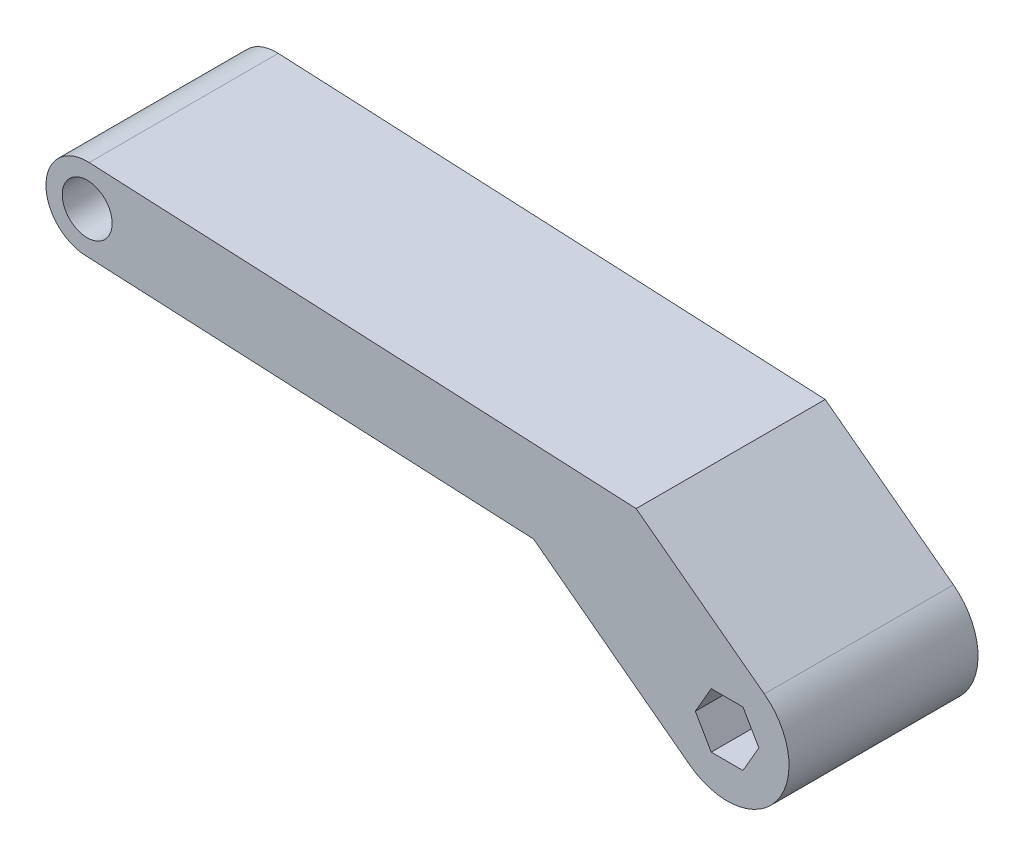
ISO-10303-21;
HEADER;
FILE_DESCRIPTION(('STEP AP214'),'2;1');
FILE_NAME('part.step','',(''),(''),'','','');
FILE_SCHEMA(('AUTOMOTIVE_DESIGN { 1 0 10303 214 1 1 1 1 }'));
ENDSEC;
DATA;
#1=APPLICATION_CONTEXT('core data for automotive mechanical design processes');
#2=APPLICATION_PROTOCOL_DEFINITION('international standard','automotive_design',2000,#1);
#3=PRODUCT_CONTEXT('',#1,'mechanical');
#4=PRODUCT('Part','Part','',(#3));
#5=PRODUCT_RELATED_PRODUCT_CATEGORY('part','',(#4));
#6=PRODUCT_DEFINITION_FORMATION('','',#4);
#7=PRODUCT_DEFINITION_CONTEXT('part definition',#1,'design');
#8=PRODUCT_DEFINITION('design','',#6,#7);
#9=PRODUCT_DEFINITION_SHAPE('','',#8);
#10=(LENGTH_UNIT() NAMED_UNIT(*) SI_UNIT(.MILLI.,.METRE.));
#11=(NAMED_UNIT(*) PLANE_ANGLE_UNIT() SI_UNIT($,.RADIAN.));
#12=(NAMED_UNIT(*) SI_UNIT($,.STERADIAN.) SOLID_ANGLE_UNIT());
#13=UNCERTAINTY_MEASURE_WITH_UNIT(LENGTH_MEASURE(1.E-05),#10,'distance_accuracy_value','');
#14=(GEOMETRIC_REPRESENTATION_CONTEXT(3) GLOBAL_UNCERTAINTY_ASSIGNED_CONTEXT((#13)) GLOBAL_UNIT_ASSIGNED_CONTEXT((#10,
#11,#12)) REPRESENTATION_CONTEXT('',''));
#15=CARTESIAN_POINT('',(0.,0.,0.));
#16=DIRECTION('',(0.,0.,1.));
#17=DIRECTION('',(1.,0.,0.));
#18=AXIS2_PLACEMENT_3D('',#15,#16,#17);
#19=CARTESIAN_POINT('',(0.,0.,27.5));
#20=DIRECTION('',(0.,0.,1.));
#21=DIRECTION('',(1.,0.,0.));
#22=AXIS2_PLACEMENT_3D('',#19,#20,#21);
#23=PLANE('',#22);
#24=CARTESIAN_POINT('',(0.,0.,27.5));
#25=DIRECTION('',(0.,0.,1.));
#26=DIRECTION('',(1.,0.,0.));
#27=AXIS2_PLACEMENT_3D('',#24,#25,#26);
#28=CIRCLE('',#27,9.);
#29=CARTESIAN_POINT('',(-5.41166559982789,-7.1912360158487,27.5));
#30=VERTEX_POINT('',#29);
#31=CARTESIAN_POINT('',(5.41166559982789,7.19123601584869,27.5));
#32=VERTEX_POINT('',#31);
#33=EDGE_CURVE('E153',#30,#32,#28,.T.);
#34=ORIENTED_EDGE('',*,*,#33,.T.);
#35=DIRECTION('',(-0.799026223983188,0.601296177758655,0.));
#36=VECTOR('',#35,1.);
#37=CARTESIAN_POINT('',(-13.2303574072712,21.2200336239901,27.5));
#38=LINE('',#37,#36);
#39=CARTESIAN_POINT('',(-13.2303574072712,21.2200336239901,27.5));
#40=VERTEX_POINT('',#39);
#41=EDGE_CURVE('E157',#32,#40,#38,.T.);
#42=ORIENTED_EDGE('',*,*,#41,.T.);
#43=DIRECTION('',(-0.99885378402219,0.0478656259183228,0.));
#44=VECTOR('',#43,1.);
#45=CARTESIAN_POINT('',(-92.7853995460539,25.0323552548873,27.5));
#46=LINE('',#45,#44);
#47=CARTESIAN_POINT('',(-92.7853995460539,25.0323552548873,27.5));
#48=VERTEX_POINT('',#47);
#49=EDGE_CURVE('E160',#40,#48,#46,.T.);
#50=ORIENTED_EDGE('',*,*,#49,.T.);
#51=CARTESIAN_POINT('',(-93.0725933015638,19.0392325507542,27.5));
#52=DIRECTION('',(0.,0.,1.));
#53=DIRECTION('',(1.,0.,0.));
#54=AXIS2_PLACEMENT_3D('',#51,#52,#53);
#55=CIRCLE('',#54,6.);
#56=CARTESIAN_POINT('',(-93.3597870570737,13.0461098466211,27.5));
#57=VERTEX_POINT('',#56);
#58=EDGE_CURVE('E163',#48,#57,#55,.T.);
#59=ORIENTED_EDGE('',*,*,#58,.T.);
#60=DIRECTION('',(0.99885378402219,-0.0478656259183231,0.));
#61=VECTOR('',#60,1.);
#62=CARTESIAN_POINT('',(-93.3597870570737,13.0461098466211,27.5));
#63=LINE('',#62,#61);
#64=CARTESIAN_POINT('',(-28.151470977111,9.92129126538824,27.5));
#65=VERTEX_POINT('',#64);
#66=EDGE_CURVE('E166',#57,#65,#63,.T.);
#67=ORIENTED_EDGE('',*,*,#66,.T.);
#68=DIRECTION('',(0.799026223983188,-0.601296177758655,0.));
#69=VECTOR('',#68,1.);
#70=CARTESIAN_POINT('',(-5.41166559982789,-7.1912360158487,27.5));
#71=LINE('',#70,#69);
#72=EDGE_CURVE('E169',#65,#30,#71,.T.);
#73=ORIENTED_EDGE('',*,*,#72,.T.);
#74=EDGE_LOOP('',(#34,#42,#50,#59,#67,#73));
#75=FACE_BOUND('',#74,.T.);
#76=CARTESIAN_POINT('',(-93.0725933015638,19.0392325507542,27.5));
#77=DIRECTION('',(0.,0.,1.));
#78=DIRECTION('',(1.,0.,0.));
#79=AXIS2_PLACEMENT_3D('',#76,#77,#78);
#80=CIRCLE('',#79,3.62850408907859);
#81=CARTESIAN_POINT('',(-89.4440892124852,19.0392325507542,27.5));
#82=VERTEX_POINT('',#81);
#83=EDGE_CURVE('E147',#82,#82,#80,.T.);
#84=ORIENTED_EDGE('',*,*,#83,.F.);
#85=EDGE_LOOP('',(#84));
#86=FACE_BOUND('',#85,.T.);
#87=DIRECTION('',(-0.5,0.866025403784439,0.));
#88=VECTOR('',#87,1.);
#89=CARTESIAN_POINT('',(4.61880215351701,0.,27.5));
#90=LINE('',#89,#88);
#91=CARTESIAN_POINT('',(4.61880215351701,0.,27.5));
#92=VERTEX_POINT('',#91);
#93=CARTESIAN_POINT('',(2.3094010767585,4.,27.5));
#94=VERTEX_POINT('',#93);
#95=EDGE_CURVE('E77',#92,#94,#90,.T.);
#96=ORIENTED_EDGE('',*,*,#95,.F.);
#97=DIRECTION('',(0.5,0.866025403784439,0.));
#98=VECTOR('',#97,1.);
#99=CARTESIAN_POINT('',(2.3094010767585,-4.,27.5));
#100=LINE('',#99,#98);
#101=CARTESIAN_POINT('',(2.3094010767585,-4.,27.5));
#102=VERTEX_POINT('',#101);
#103=EDGE_CURVE('E45',#102,#92,#100,.T.);
#104=ORIENTED_EDGE('',*,*,#103,.F.);
#105=DIRECTION('',(1.,0.,0.));
#106=VECTOR('',#105,1.);
#107=CARTESIAN_POINT('',(-2.3094010767585,-4.,27.5));
#108=LINE('',#107,#106);
#109=CARTESIAN_POINT('',(-2.3094010767585,-4.,27.5));
#110=VERTEX_POINT('',#109);
#111=EDGE_CURVE('E127',#110,#102,#108,.T.);
#112=ORIENTED_EDGE('',*,*,#111,.F.);
#113=DIRECTION('',(0.5,-0.866025403784439,0.));
#114=VECTOR('',#113,1.);
#115=CARTESIAN_POINT('',(-4.61880215351701,0.,27.5));
#116=LINE('',#115,#114);
#117=CARTESIAN_POINT('',(-4.61880215351701,0.,27.5));
#118=VERTEX_POINT('',#117);
#119=EDGE_CURVE('E129',#118,#110,#116,.T.);
#120=ORIENTED_EDGE('',*,*,#119,.F.);
#121=DIRECTION('',(-0.5,-0.866025403784438,0.));
#122=VECTOR('',#121,1.);
#123=CARTESIAN_POINT('',(-2.3094010767585,4.,27.5));
#124=LINE('',#123,#122);
#125=CARTESIAN_POINT('',(-2.3094010767585,4.,27.5));
#126=VERTEX_POINT('',#125);
#127=EDGE_CURVE('E132',#126,#118,#124,.T.);
#128=ORIENTED_EDGE('',*,*,#127,.F.);
#129=DIRECTION('',(-1.,0.,0.));
#130=VECTOR('',#129,1.);
#131=CARTESIAN_POINT('',(2.3094010767585,4.,27.5));
#132=LINE('',#131,#130);
#133=EDGE_CURVE('E108',#94,#126,#132,.T.);
#134=ORIENTED_EDGE('',*,*,#133,.F.);
#135=EDGE_LOOP('',(#96,#104,#112,#120,#128,#134));
#136=FACE_BOUND('',#135,.T.);
#137=ADVANCED_FACE('F41',(#75,#86,#136),#23,.T.);
#138=CARTESIAN_POINT('',(0.,0.,0.));
#139=DIRECTION('',(0.,0.,1.));
#140=DIRECTION('',(1.,0.,0.));
#141=AXIS2_PLACEMENT_3D('',#138,#139,#140);
#142=PLANE('',#141);
#143=CARTESIAN_POINT('',(-93.0725933015638,19.0392325507542,0.));
#144=DIRECTION('',(0.,0.,1.));
#145=DIRECTION('',(1.,0.,0.));
#146=AXIS2_PLACEMENT_3D('',#143,#144,#145);
#147=CIRCLE('',#146,3.62850408907859);
#148=CARTESIAN_POINT('',(-89.4440892124852,19.0392325507542,0.));
#149=VERTEX_POINT('',#148);
#150=EDGE_CURVE('E146',#149,#149,#147,.T.);
#151=ORIENTED_EDGE('',*,*,#150,.T.);
#152=EDGE_LOOP('',(#151));
#153=FACE_BOUND('',#152,.T.);
#154=CARTESIAN_POINT('',(0.,0.,0.));
#155=DIRECTION('',(0.,0.,1.));
#156=DIRECTION('',(1.,0.,0.));
#157=AXIS2_PLACEMENT_3D('',#154,#155,#156);
#158=CIRCLE('',#157,9.);
#159=CARTESIAN_POINT('',(-5.41166559982789,-7.1912360158487,0.));
#160=VERTEX_POINT('',#159);
#161=CARTESIAN_POINT('',(5.41166559982789,7.19123601584869,0.));
#162=VERTEX_POINT('',#161);
#163=EDGE_CURVE('E150',#160,#162,#158,.T.);
#164=ORIENTED_EDGE('',*,*,#163,.F.);
#165=DIRECTION('',(0.799026223983188,-0.601296177758655,0.));
#166=VECTOR('',#165,1.);
#167=CARTESIAN_POINT('',(-5.41166559982789,-7.1912360158487,0.));
#168=LINE('',#167,#166);
#169=CARTESIAN_POINT('',(-28.151470977111,9.92129126538824,0.));
#170=VERTEX_POINT('',#169);
#171=EDGE_CURVE('E156',#170,#160,#168,.T.);
#172=ORIENTED_EDGE('',*,*,#171,.F.);
#173=DIRECTION('',(0.99885378402219,-0.0478656259183231,0.));
#174=VECTOR('',#173,1.);
#175=CARTESIAN_POINT('',(-93.3597870570737,13.0461098466211,0.));
#176=LINE('',#175,#174);
#177=CARTESIAN_POINT('',(-93.3597870570737,13.0461098466211,0.));
#178=VERTEX_POINT('',#177);
#179=EDGE_CURVE('E184',#178,#170,#176,.T.);
#180=ORIENTED_EDGE('',*,*,#179,.F.);
#181=CARTESIAN_POINT('',(-93.0725933015638,19.0392325507542,0.));
#182=DIRECTION('',(0.,0.,1.));
#183=DIRECTION('',(1.,0.,0.));
#184=AXIS2_PLACEMENT_3D('',#181,#182,#183);
#185=CIRCLE('',#184,6.);
#186=CARTESIAN_POINT('',(-92.7853995460539,25.0323552548873,0.));
#187=VERTEX_POINT('',#186);
#188=EDGE_CURVE('E181',#187,#178,#185,.T.);
#189=ORIENTED_EDGE('',*,*,#188,.F.);
#190=DIRECTION('',(-0.99885378402219,0.0478656259183228,0.));
#191=VECTOR('',#190,1.);
#192=CARTESIAN_POINT('',(-92.7853995460539,25.0323552548873,0.));
#193=LINE('',#192,#191);
#194=CARTESIAN_POINT('',(-13.2303574072712,21.2200336239901,0.));
#195=VERTEX_POINT('',#194);
#196=EDGE_CURVE('E178',#195,#187,#193,.T.);
#197=ORIENTED_EDGE('',*,*,#196,.F.);
#198=DIRECTION('',(-0.799026223983188,0.601296177758655,0.));
#199=VECTOR('',#198,1.);
#200=CARTESIAN_POINT('',(-13.2303574072712,21.2200336239901,0.));
#201=LINE('',#200,#199);
#202=EDGE_CURVE('E175',#162,#195,#201,.T.);
#203=ORIENTED_EDGE('',*,*,#202,.F.);
#204=EDGE_LOOP('',(#164,#172,#180,#189,#197,#203));
#205=FACE_BOUND('',#204,.T.);
#206=DIRECTION('',(0.5,0.866025403784439,0.));
#207=VECTOR('',#206,1.);
#208=CARTESIAN_POINT('',(2.3094010767585,-4.,0.));
#209=LINE('',#208,#207);
#210=CARTESIAN_POINT('',(2.3094010767585,-4.,0.));
#211=VERTEX_POINT('',#210);
#212=CARTESIAN_POINT('',(4.61880215351701,0.,0.));
#213=VERTEX_POINT('',#212);
#214=EDGE_CURVE('E11',#211,#213,#209,.T.);
#215=ORIENTED_EDGE('',*,*,#214,.T.);
#216=DIRECTION('',(-0.5,0.866025403784439,0.));
#217=VECTOR('',#216,1.);
#218=CARTESIAN_POINT('',(4.61880215351701,0.,0.));
#219=LINE('',#218,#217);
#220=CARTESIAN_POINT('',(2.3094010767585,4.,0.));
#221=VERTEX_POINT('',#220);
#222=EDGE_CURVE('E51',#213,#221,#219,.T.);
#223=ORIENTED_EDGE('',*,*,#222,.T.);
#224=DIRECTION('',(-1.,0.,0.));
#225=VECTOR('',#224,1.);
#226=CARTESIAN_POINT('',(2.3094010767585,4.,0.));
#227=LINE('',#226,#225);
#228=CARTESIAN_POINT('',(-2.3094010767585,4.,0.));
#229=VERTEX_POINT('',#228);
#230=EDGE_CURVE('E106',#221,#229,#227,.T.);
#231=ORIENTED_EDGE('',*,*,#230,.T.);
#232=DIRECTION('',(-0.5,-0.866025403784438,0.));
#233=VECTOR('',#232,1.);
#234=CARTESIAN_POINT('',(-2.3094010767585,4.,0.));
#235=LINE('',#234,#233);
#236=CARTESIAN_POINT('',(-4.61880215351701,0.,0.));
#237=VERTEX_POINT('',#236);
#238=EDGE_CURVE('E115',#229,#237,#235,.T.);
#239=ORIENTED_EDGE('',*,*,#238,.T.);
#240=DIRECTION('',(0.5,-0.866025403784439,0.));
#241=VECTOR('',#240,1.);
#242=CARTESIAN_POINT('',(-4.61880215351701,0.,0.));
#243=LINE('',#242,#241);
#244=CARTESIAN_POINT('',(-2.3094010767585,-4.,0.));
#245=VERTEX_POINT('',#244);
#246=EDGE_CURVE('E120',#237,#245,#243,.T.);
#247=ORIENTED_EDGE('',*,*,#246,.T.);
#248=DIRECTION('',(1.,0.,0.));
#249=VECTOR('',#248,1.);
#250=CARTESIAN_POINT('',(-2.3094010767585,-4.,0.));
#251=LINE('',#250,#249);
#252=EDGE_CURVE('E134',#245,#211,#251,.T.);
#253=ORIENTED_EDGE('',*,*,#252,.T.);
#254=EDGE_LOOP('',(#215,#223,#231,#239,#247,#253));
#255=FACE_BOUND('',#254,.T.);
#256=ADVANCED_FACE('F122',(#153,#205,#255),#142,.F.);
#257=CARTESIAN_POINT('',(0.,0.,27.5));
#258=DIRECTION('',(0.,0.,-1.));
#259=DIRECTION('',(-1.,0.,0.));
#260=AXIS2_PLACEMENT_3D('',#257,#258,#259);
#261=CYLINDRICAL_SURFACE('',#260,9.);
#262=ORIENTED_EDGE('',*,*,#163,.T.);
#263=DIRECTION('',(0.,0.,-1.));
#264=VECTOR('',#263,1.);
#265=CARTESIAN_POINT('',(5.41166559982789,7.19123601584869,27.5));
#266=LINE('',#265,#264);
#267=EDGE_CURVE('E203',#32,#162,#266,.T.);
#268=ORIENTED_EDGE('',*,*,#267,.F.);
#269=ORIENTED_EDGE('',*,*,#33,.F.);
#270=DIRECTION('',(0.,0.,-1.));
#271=VECTOR('',#270,1.);
#272=CARTESIAN_POINT('',(-5.41166559982789,-7.1912360158487,27.5));
#273=LINE('',#272,#271);
#274=EDGE_CURVE('E172',#30,#160,#273,.T.);
#275=ORIENTED_EDGE('',*,*,#274,.T.);
#276=EDGE_LOOP('',(#262,#268,#269,#275));
#277=FACE_BOUND('',#276,.T.);
#278=ADVANCED_FACE('F216',(#277),#261,.T.);
#279=CARTESIAN_POINT('',(-13.2303574072712,21.2200336239901,27.5));
#280=DIRECTION('',(-0.601296177758655,-0.799026223983188,0.));
#281=DIRECTION('',(0.799026223983188,-0.601296177758655,0.));
#282=AXIS2_PLACEMENT_3D('',#279,#280,#281);
#283=PLANE('',#282);
#284=ORIENTED_EDGE('',*,*,#202,.T.);
#285=DIRECTION('',(0.,0.,-1.));
#286=VECTOR('',#285,1.);
#287=CARTESIAN_POINT('',(-13.2303574072712,21.2200336239901,27.5));
#288=LINE('',#287,#286);
#289=EDGE_CURVE('E200',#40,#195,#288,.T.);
#290=ORIENTED_EDGE('',*,*,#289,.F.);
#291=ORIENTED_EDGE('',*,*,#41,.F.);
#292=ORIENTED_EDGE('',*,*,#267,.T.);
#293=EDGE_LOOP('',(#284,#290,#291,#292));
#294=FACE_BOUND('',#293,.T.);
#295=ADVANCED_FACE('F208',(#294),#283,.F.);
#296=CARTESIAN_POINT('',(-92.7853995460539,25.0323552548873,27.5));
#297=DIRECTION('',(-0.0478656259183228,-0.99885378402219,0.));
#298=DIRECTION('',(0.99885378402219,-0.0478656259183228,0.));
#299=AXIS2_PLACEMENT_3D('',#296,#297,#298);
#300=PLANE('',#299);
#301=ORIENTED_EDGE('',*,*,#196,.T.);
#302=DIRECTION('',(0.,0.,-1.));
#303=VECTOR('',#302,1.);
#304=CARTESIAN_POINT('',(-92.7853995460539,25.0323552548873,27.5));
#305=LINE('',#304,#303);
#306=EDGE_CURVE('E197',#48,#187,#305,.T.);
#307=ORIENTED_EDGE('',*,*,#306,.F.);
#308=ORIENTED_EDGE('',*,*,#49,.F.);
#309=ORIENTED_EDGE('',*,*,#289,.T.);
#310=EDGE_LOOP('',(#301,#307,#308,#309));
#311=FACE_BOUND('',#310,.T.);
#312=ADVANCED_FACE('F248',(#311),#300,.F.);
#313=CARTESIAN_POINT('',(-93.0725933015638,19.0392325507542,27.5));
#314=DIRECTION('',(0.,0.,-1.));
#315=DIRECTION('',(-1.,0.,0.));
#316=AXIS2_PLACEMENT_3D('',#313,#314,#315);
#317=CYLINDRICAL_SURFACE('',#316,6.);
#318=ORIENTED_EDGE('',*,*,#188,.T.);
#319=DIRECTION('',(0.,0.,-1.));
#320=VECTOR('',#319,1.);
#321=CARTESIAN_POINT('',(-93.3597870570737,13.0461098466211,27.5));
#322=LINE('',#321,#320);
#323=EDGE_CURVE('E194',#57,#178,#322,.T.);
#324=ORIENTED_EDGE('',*,*,#323,.F.);
#325=ORIENTED_EDGE('',*,*,#58,.F.);
#326=ORIENTED_EDGE('',*,*,#306,.T.);
#327=EDGE_LOOP('',(#318,#324,#325,#326));
#328=FACE_BOUND('',#327,.T.);
#329=ADVANCED_FACE('F253',(#328),#317,.T.);
#330=CARTESIAN_POINT('',(-93.3597870570737,13.0461098466211,27.5));
#331=DIRECTION('',(0.0478656259183231,0.99885378402219,0.));
#332=DIRECTION('',(-0.99885378402219,0.0478656259183231,0.));
#333=AXIS2_PLACEMENT_3D('',#330,#331,#332);
#334=PLANE('',#333);
#335=ORIENTED_EDGE('',*,*,#179,.T.);
#336=DIRECTION('',(0.,0.,-1.));
#337=VECTOR('',#336,1.);
#338=CARTESIAN_POINT('',(-28.151470977111,9.92129126538824,27.5));
#339=LINE('',#338,#337);
#340=EDGE_CURVE('E191',#65,#170,#339,.T.);
#341=ORIENTED_EDGE('',*,*,#340,.F.);
#342=ORIENTED_EDGE('',*,*,#66,.F.);
#343=ORIENTED_EDGE('',*,*,#323,.T.);
#344=EDGE_LOOP('',(#335,#341,#342,#343));
#345=FACE_BOUND('',#344,.T.);
#346=ADVANCED_FACE('F258',(#345),#334,.F.);
#347=CARTESIAN_POINT('',(-5.41166559982789,-7.1912360158487,27.5));
#348=DIRECTION('',(0.601296177758655,0.799026223983188,0.));
#349=DIRECTION('',(-0.799026223983188,0.601296177758655,0.));
#350=AXIS2_PLACEMENT_3D('',#347,#348,#349);
#351=PLANE('',#350);
#352=ORIENTED_EDGE('',*,*,#171,.T.);
#353=ORIENTED_EDGE('',*,*,#274,.F.);
#354=ORIENTED_EDGE('',*,*,#72,.F.);
#355=ORIENTED_EDGE('',*,*,#340,.T.);
#356=EDGE_LOOP('',(#352,#353,#354,#355));
#357=FACE_BOUND('',#356,.T.);
#358=ADVANCED_FACE('F259',(#357),#351,.F.);
#359=CARTESIAN_POINT('',(-93.0725933015638,19.0392325507542,27.5));
#360=DIRECTION('',(0.,0.,-1.));
#361=DIRECTION('',(-1.,0.,0.));
#362=AXIS2_PLACEMENT_3D('',#359,#360,#361);
#363=CYLINDRICAL_SURFACE('',#362,3.62850408907859);
#364=ORIENTED_EDGE('',*,*,#83,.T.);
#365=EDGE_LOOP('',(#364));
#366=FACE_BOUND('',#365,.T.);
#367=ORIENTED_EDGE('',*,*,#150,.F.);
#368=EDGE_LOOP('',(#367));
#369=FACE_BOUND('',#368,.T.);
#370=ADVANCED_FACE('F261',(#366,#369),#363,.F.);
#371=CARTESIAN_POINT('',(2.3094010767585,-4.,27.5));
#372=DIRECTION('',(-0.866025403784439,0.5,0.));
#373=DIRECTION('',(-0.5,-0.866025403784439,0.));
#374=AXIS2_PLACEMENT_3D('',#371,#372,#373);
#375=PLANE('',#374);
#376=ORIENTED_EDGE('',*,*,#214,.F.);
#377=DIRECTION('',(0.,0.,-1.));
#378=VECTOR('',#377,1.);
#379=CARTESIAN_POINT('',(2.3094010767585,-4.,27.5));
#380=LINE('',#379,#378);
#381=EDGE_CURVE('E130',#102,#211,#380,.T.);
#382=ORIENTED_EDGE('',*,*,#381,.F.);
#383=ORIENTED_EDGE('',*,*,#103,.T.);
#384=DIRECTION('',(0.,0.,-1.));
#385=VECTOR('',#384,1.);
#386=CARTESIAN_POINT('',(4.61880215351701,0.,27.5));
#387=LINE('',#386,#385);
#388=EDGE_CURVE('E144',#92,#213,#387,.T.);
#389=ORIENTED_EDGE('',*,*,#388,.T.);
#390=EDGE_LOOP('',(#376,#382,#383,#389));
#391=FACE_BOUND('',#390,.T.);
#392=ADVANCED_FACE('F268',(#391),#375,.T.);
#393=CARTESIAN_POINT('',(4.61880215351701,0.,27.5));
#394=DIRECTION('',(-0.866025403784439,-0.5,0.));
#395=DIRECTION('',(0.5,-0.866025403784439,0.));
#396=AXIS2_PLACEMENT_3D('',#393,#394,#395);
#397=PLANE('',#396);
#398=ORIENTED_EDGE('',*,*,#222,.F.);
#399=ORIENTED_EDGE('',*,*,#388,.F.);
#400=ORIENTED_EDGE('',*,*,#95,.T.);
#401=DIRECTION('',(0.,0.,-1.));
#402=VECTOR('',#401,1.);
#403=CARTESIAN_POINT('',(2.3094010767585,4.,27.5));
#404=LINE('',#403,#402);
#405=EDGE_CURVE('E112',#94,#221,#404,.T.);
#406=ORIENTED_EDGE('',*,*,#405,.T.);
#407=EDGE_LOOP('',(#398,#399,#400,#406));
#408=FACE_BOUND('',#407,.T.);
#409=ADVANCED_FACE('F283',(#408),#397,.T.);
#410=CARTESIAN_POINT('',(2.3094010767585,4.,27.5));
#411=DIRECTION('',(0.,-1.,0.));
#412=DIRECTION('',(0.,0.,-1.));
#413=AXIS2_PLACEMENT_3D('',#410,#411,#412);
#414=PLANE('',#413);
#415=ORIENTED_EDGE('',*,*,#230,.F.);
#416=ORIENTED_EDGE('',*,*,#405,.F.);
#417=ORIENTED_EDGE('',*,*,#133,.T.);
#418=DIRECTION('',(0.,0.,-1.));
#419=VECTOR('',#418,1.);
#420=CARTESIAN_POINT('',(-2.3094010767585,4.,27.5));
#421=LINE('',#420,#419);
#422=EDGE_CURVE('E102',#126,#229,#421,.T.);
#423=ORIENTED_EDGE('',*,*,#422,.T.);
#424=EDGE_LOOP('',(#415,#416,#417,#423));
#425=FACE_BOUND('',#424,.T.);
#426=ADVANCED_FACE('F104',(#425),#414,.T.);
#427=CARTESIAN_POINT('',(-2.3094010767585,4.,27.5));
#428=DIRECTION('',(0.866025403784439,-0.5,0.));
#429=DIRECTION('',(0.5,0.866025403784439,0.));
#430=AXIS2_PLACEMENT_3D('',#427,#428,#429);
#431=PLANE('',#430);
#432=ORIENTED_EDGE('',*,*,#238,.F.);
#433=ORIENTED_EDGE('',*,*,#422,.F.);
#434=ORIENTED_EDGE('',*,*,#127,.T.);
#435=DIRECTION('',(0.,0.,-1.));
#436=VECTOR('',#435,1.);
#437=CARTESIAN_POINT('',(-4.61880215351701,0.,27.5));
#438=LINE('',#437,#436);
#439=EDGE_CURVE('E111',#118,#237,#438,.T.);
#440=ORIENTED_EDGE('',*,*,#439,.T.);
#441=EDGE_LOOP('',(#432,#433,#434,#440));
#442=FACE_BOUND('',#441,.T.);
#443=ADVANCED_FACE('F116',(#442),#431,.T.);
#444=CARTESIAN_POINT('',(-4.61880215351701,0.,27.5));
#445=DIRECTION('',(0.866025403784439,0.5,0.));
#446=DIRECTION('',(-0.5,0.866025403784439,0.));
#447=AXIS2_PLACEMENT_3D('',#444,#445,#446);
#448=PLANE('',#447);
#449=ORIENTED_EDGE('',*,*,#246,.F.);
#450=ORIENTED_EDGE('',*,*,#439,.F.);
#451=ORIENTED_EDGE('',*,*,#119,.T.);
#452=DIRECTION('',(0.,0.,-1.));
#453=VECTOR('',#452,1.);
#454=CARTESIAN_POINT('',(-2.3094010767585,-4.,27.5));
#455=LINE('',#454,#453);
#456=EDGE_CURVE('E91',#110,#245,#455,.T.);
#457=ORIENTED_EDGE('',*,*,#456,.T.);
#458=EDGE_LOOP('',(#449,#450,#451,#457));
#459=FACE_BOUND('',#458,.T.);
#460=ADVANCED_FACE('F289',(#459),#448,.T.);
#461=CARTESIAN_POINT('',(-2.3094010767585,-4.,27.5));
#462=DIRECTION('',(0.,1.,0.));
#463=DIRECTION('',(-1.,0.,0.));
#464=AXIS2_PLACEMENT_3D('',#461,#462,#463);
#465=PLANE('',#464);
#466=ORIENTED_EDGE('',*,*,#252,.F.);
#467=ORIENTED_EDGE('',*,*,#456,.F.);
#468=ORIENTED_EDGE('',*,*,#111,.T.);
#469=ORIENTED_EDGE('',*,*,#381,.T.);
#470=EDGE_LOOP('',(#466,#467,#468,#469));
#471=FACE_BOUND('',#470,.T.);
#472=ADVANCED_FACE('F43',(#471),#465,.T.);
#473=CLOSED_SHELL('',(#137,#256,#278,#295,#312,#329,#346,#358,#370,#392,#409,#426,#443,#460,#472));
#474=MANIFOLD_SOLID_BREP('B2',#473);
#475=ADVANCED_BREP_SHAPE_REPRESENTATION('',(#18,#474),#14);
#476=SHAPE_DEFINITION_REPRESENTATION(#9,#475);
ENDSEC;
END-ISO-10303-21;
